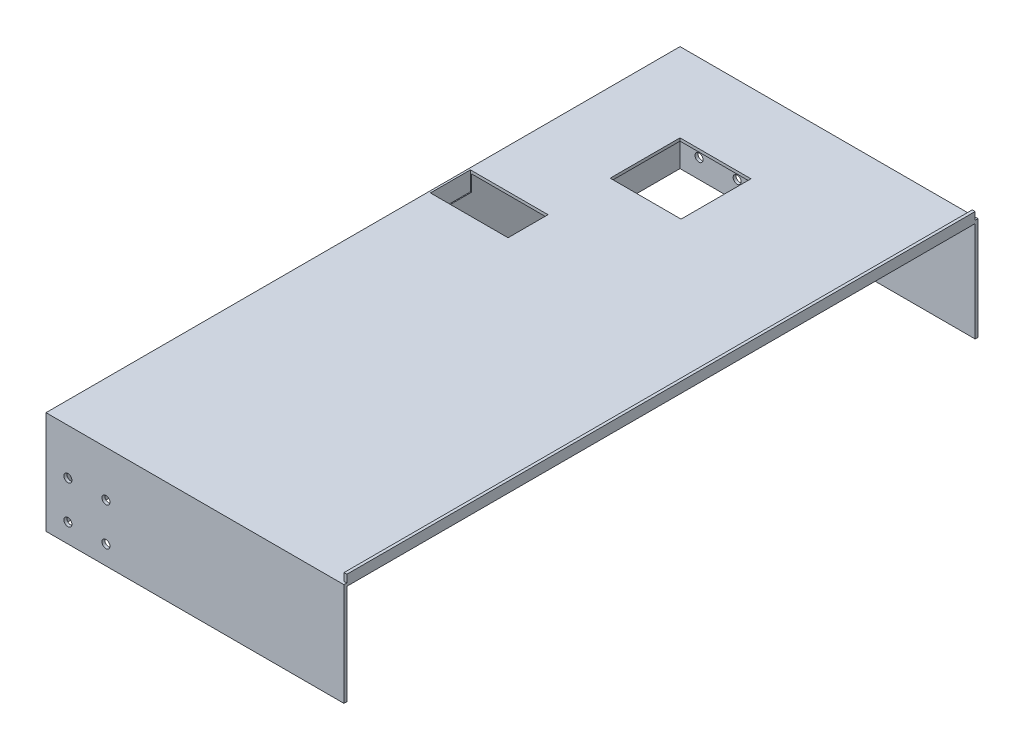
ISO-10303-21;
HEADER;
FILE_DESCRIPTION(('STEP AP214'),'2;1');
FILE_NAME('part.step','',(''),(''),'','','');
FILE_SCHEMA(('AUTOMOTIVE_DESIGN { 1 0 10303 214 1 1 1 1 }'));
ENDSEC;
DATA;
#1=APPLICATION_CONTEXT('core data for automotive mechanical design processes');
#2=APPLICATION_PROTOCOL_DEFINITION('international standard','automotive_design',2000,#1);
#3=PRODUCT_CONTEXT('',#1,'mechanical');
#4=PRODUCT('Part','Part','',(#3));
#5=PRODUCT_RELATED_PRODUCT_CATEGORY('part','',(#4));
#6=PRODUCT_DEFINITION_FORMATION('','',#4);
#7=PRODUCT_DEFINITION_CONTEXT('part definition',#1,'design');
#8=PRODUCT_DEFINITION('design','',#6,#7);
#9=PRODUCT_DEFINITION_SHAPE('','',#8);
#10=(LENGTH_UNIT() NAMED_UNIT(*) SI_UNIT(.MILLI.,.METRE.));
#11=(NAMED_UNIT(*) PLANE_ANGLE_UNIT() SI_UNIT($,.RADIAN.));
#12=(NAMED_UNIT(*) SI_UNIT($,.STERADIAN.) SOLID_ANGLE_UNIT());
#13=UNCERTAINTY_MEASURE_WITH_UNIT(LENGTH_MEASURE(1.E-05),#10,'distance_accuracy_value','');
#14=(GEOMETRIC_REPRESENTATION_CONTEXT(3) GLOBAL_UNCERTAINTY_ASSIGNED_CONTEXT((#13)) GLOBAL_UNIT_ASSIGNED_CONTEXT((#10,
#11,#12)) REPRESENTATION_CONTEXT('',''));
#15=CARTESIAN_POINT('',(0.,0.,0.));
#16=DIRECTION('',(0.,0.,1.));
#17=DIRECTION('',(1.,0.,0.));
#18=AXIS2_PLACEMENT_3D('',#15,#16,#17);
#19=CARTESIAN_POINT('',(179.478375919899,1.5,-330.));
#20=DIRECTION('',(0.,0.,1.));
#21=DIRECTION('',(1.,0.,0.));
#22=AXIS2_PLACEMENT_3D('',#19,#20,#21);
#23=PLANE('',#22);
#24=DIRECTION('',(1.,0.,0.));
#25=VECTOR('',#24,1.);
#26=CARTESIAN_POINT('',(179.478375919899,1.5,-330.));
#27=LINE('',#26,#25);
#28=CARTESIAN_POINT('',(332.978375919899,1.5,-330.));
#29=VERTEX_POINT('',#28);
#30=CARTESIAN_POINT('',(334.478375919899,1.49999999999998,-330.));
#31=VERTEX_POINT('',#30);
#32=EDGE_CURVE('E307',#29,#31,#27,.T.);
#33=ORIENTED_EDGE('',*,*,#32,.F.);
#34=DIRECTION('',(0.,-1.,0.));
#35=VECTOR('',#34,1.);
#36=CARTESIAN_POINT('',(332.978375919899,5.5,-330.));
#37=LINE('',#36,#35);
#38=CARTESIAN_POINT('',(332.978375919899,5.5,-330.));
#39=VERTEX_POINT('',#38);
#40=EDGE_CURVE('E340',#39,#29,#37,.T.);
#41=ORIENTED_EDGE('',*,*,#40,.F.);
#42=DIRECTION('',(-1.,0.,0.));
#43=VECTOR('',#42,1.);
#44=CARTESIAN_POINT('',(334.478375919899,5.5,-330.));
#45=LINE('',#44,#43);
#46=CARTESIAN_POINT('',(334.478375919899,5.5,-330.));
#47=VERTEX_POINT('',#46);
#48=EDGE_CURVE('E323',#47,#39,#45,.T.);
#49=ORIENTED_EDGE('',*,*,#48,.F.);
#50=DIRECTION('',(0.,-1.,0.));
#51=VECTOR('',#50,1.);
#52=CARTESIAN_POINT('',(334.478375919899,1.5,-330.));
#53=LINE('',#52,#51);
#54=EDGE_CURVE('E311',#47,#31,#53,.T.);
#55=ORIENTED_EDGE('',*,*,#54,.T.);
#56=EDGE_LOOP('',(#33,#41,#49,#55));
#57=FACE_BOUND('',#56,.T.);
#58=ADVANCED_FACE('F33',(#57),#23,.F.);
#59=CARTESIAN_POINT('',(0.,1.5,0.));
#60=DIRECTION('',(0.,-1.,0.));
#61=DIRECTION('',(0.,0.,-1.));
#62=AXIS2_PLACEMENT_3D('',#59,#60,#61);
#63=PLANE('',#62);
#64=DIRECTION('',(1.,0.,0.));
#65=VECTOR('',#64,1.);
#66=CARTESIAN_POINT('',(219.478375919899,1.5,-253.305102612016));
#67=LINE('',#66,#65);
#68=CARTESIAN_POINT('',(219.478375919899,1.5,-253.305102612016));
#69=VERTEX_POINT('',#68);
#70=CARTESIAN_POINT('',(256.725232770007,1.5,-253.305102612016));
#71=VERTEX_POINT('',#70);
#72=EDGE_CURVE('E193',#69,#71,#67,.T.);
#73=ORIENTED_EDGE('',*,*,#72,.F.);
#74=DIRECTION('',(0.,0.,1.));
#75=VECTOR('',#74,1.);
#76=CARTESIAN_POINT('',(219.478375919899,1.5,-289.999999999999));
#77=LINE('',#76,#75);
#78=CARTESIAN_POINT('',(219.478375919899,1.5,-289.999999999999));
#79=VERTEX_POINT('',#78);
#80=EDGE_CURVE('E48',#79,#69,#77,.T.);
#81=ORIENTED_EDGE('',*,*,#80,.F.);
#82=DIRECTION('',(-1.,0.,0.));
#83=VECTOR('',#82,1.);
#84=CARTESIAN_POINT('',(219.478375919899,1.5,-289.999999999999));
#85=LINE('',#84,#83);
#86=CARTESIAN_POINT('',(256.725232770007,1.5,-289.999999999999));
#87=VERTEX_POINT('',#86);
#88=EDGE_CURVE('E200',#87,#79,#85,.T.);
#89=ORIENTED_EDGE('',*,*,#88,.F.);
#90=DIRECTION('',(0.,0.,-1.));
#91=VECTOR('',#90,1.);
#92=CARTESIAN_POINT('',(256.725232770007,1.5,-289.999999999999));
#93=LINE('',#92,#91);
#94=EDGE_CURVE('E184',#71,#87,#93,.T.);
#95=ORIENTED_EDGE('',*,*,#94,.F.);
#96=EDGE_LOOP('',(#73,#81,#89,#95));
#97=FACE_BOUND('',#96,.T.);
#98=DIRECTION('',(1.,0.,0.));
#99=VECTOR('',#98,1.);
#100=CARTESIAN_POINT('',(178.98746502645,1.5,-199.381133371279));
#101=LINE('',#100,#99);
#102=CARTESIAN_POINT('',(178.98746502645,1.5,-199.381133371279));
#103=VERTEX_POINT('',#102);
#104=CARTESIAN_POINT('',(219.764181281087,1.5,-199.381133371279));
#105=VERTEX_POINT('',#104);
#106=EDGE_CURVE('E220',#103,#105,#101,.T.);
#107=ORIENTED_EDGE('',*,*,#106,.F.);
#108=DIRECTION('',(0.,0.,1.));
#109=VECTOR('',#108,1.);
#110=CARTESIAN_POINT('',(178.98746502645,1.5,-220.384779624737));
#111=LINE('',#110,#109);
#112=CARTESIAN_POINT('',(178.98746502645,1.5,-220.384779624737));
#113=VERTEX_POINT('',#112);
#114=EDGE_CURVE('E207',#113,#103,#111,.T.);
#115=ORIENTED_EDGE('',*,*,#114,.F.);
#116=DIRECTION('',(-1.,0.,0.));
#117=VECTOR('',#116,1.);
#118=CARTESIAN_POINT('',(178.98746502645,1.5,-220.384779624737));
#119=LINE('',#118,#117);
#120=CARTESIAN_POINT('',(219.764181281087,1.5,-220.384779624737));
#121=VERTEX_POINT('',#120);
#122=EDGE_CURVE('E214',#121,#113,#119,.T.);
#123=ORIENTED_EDGE('',*,*,#122,.F.);
#124=DIRECTION('',(0.,0.,-1.));
#125=VECTOR('',#124,1.);
#126=CARTESIAN_POINT('',(219.764181281087,1.5,-220.384779624737));
#127=LINE('',#126,#125);
#128=EDGE_CURVE('E223',#105,#121,#127,.T.);
#129=ORIENTED_EDGE('',*,*,#128,.F.);
#130=EDGE_LOOP('',(#107,#115,#123,#129));
#131=FACE_BOUND('',#130,.T.);
#132=DIRECTION('',(1.,0.,0.));
#133=VECTOR('',#132,1.);
#134=CARTESIAN_POINT('',(334.478375919899,1.5,0.));
#135=LINE('',#134,#133);
#136=CARTESIAN_POINT('',(332.978375919899,1.5,0.));
#137=VERTEX_POINT('',#136);
#138=CARTESIAN_POINT('',(334.478375919899,1.5,0.));
#139=VERTEX_POINT('',#138);
#140=EDGE_CURVE('E324',#137,#139,#135,.T.);
#141=ORIENTED_EDGE('',*,*,#140,.F.);
#142=DIRECTION('',(0.,0.,1.));
#143=VECTOR('',#142,1.);
#144=CARTESIAN_POINT('',(332.978375919899,1.5,0.));
#145=LINE('',#144,#143);
#146=EDGE_CURVE('E319',#29,#137,#145,.T.);
#147=ORIENTED_EDGE('',*,*,#146,.F.);
#148=ORIENTED_EDGE('',*,*,#32,.T.);
#149=DIRECTION('',(0.,0.,1.));
#150=VECTOR('',#149,1.);
#151=CARTESIAN_POINT('',(334.478375919899,1.49999999999998,-331.5));
#152=LINE('',#151,#150);
#153=CARTESIAN_POINT('',(334.478375919899,1.49999999999998,-331.5));
#154=VERTEX_POINT('',#153);
#155=EDGE_CURVE('E316',#154,#31,#152,.T.);
#156=ORIENTED_EDGE('',*,*,#155,.F.);
#157=DIRECTION('',(1.,0.,0.));
#158=VECTOR('',#157,1.);
#159=CARTESIAN_POINT('',(179.478375919899,1.5,-331.5));
#160=LINE('',#159,#158);
#161=CARTESIAN_POINT('',(177.978375919899,1.5,-331.5));
#162=VERTEX_POINT('',#161);
#163=EDGE_CURVE('E296',#162,#154,#160,.T.);
#164=ORIENTED_EDGE('',*,*,#163,.F.);
#165=DIRECTION('',(0.,0.,-1.));
#166=VECTOR('',#165,1.);
#167=CARTESIAN_POINT('',(177.978375919899,1.5,-331.5));
#168=LINE('',#167,#166);
#169=CARTESIAN_POINT('',(177.978375919899,1.5,1.50000000000005));
#170=VERTEX_POINT('',#169);
#171=EDGE_CURVE('E290',#170,#162,#168,.T.);
#172=ORIENTED_EDGE('',*,*,#171,.F.);
#173=DIRECTION('',(-1.,0.,0.));
#174=VECTOR('',#173,1.);
#175=CARTESIAN_POINT('',(179.478375919899,1.5,1.5));
#176=LINE('',#175,#174);
#177=CARTESIAN_POINT('',(334.478375919899,1.5,1.5));
#178=VERTEX_POINT('',#177);
#179=EDGE_CURVE('E350',#178,#170,#176,.T.);
#180=ORIENTED_EDGE('',*,*,#179,.F.);
#181=DIRECTION('',(0.,0.,-1.));
#182=VECTOR('',#181,1.);
#183=CARTESIAN_POINT('',(334.478375919899,1.5,-330.));
#184=LINE('',#183,#182);
#185=EDGE_CURVE('E362',#178,#139,#184,.T.);
#186=ORIENTED_EDGE('',*,*,#185,.T.);
#187=EDGE_LOOP('',(#141,#147,#148,#156,#164,#172,#180,#186));
#188=FACE_BOUND('',#187,.T.);
#189=ADVANCED_FACE('F197',(#97,#131,#188),#63,.F.);
#190=CARTESIAN_POINT('',(334.478375919899,1.5,-330.));
#191=DIRECTION('',(-1.,0.,0.));
#192=DIRECTION('',(0.,0.,1.));
#193=AXIS2_PLACEMENT_3D('',#190,#191,#192);
#194=PLANE('',#193);
#195=DIRECTION('',(0.,0.,-1.));
#196=VECTOR('',#195,1.);
#197=CARTESIAN_POINT('',(334.478375919899,0.,-330.));
#198=LINE('',#197,#196);
#199=CARTESIAN_POINT('',(334.478375919899,0.,0.));
#200=VERTEX_POINT('',#199);
#201=CARTESIAN_POINT('',(334.478375919899,0.,-330.));
#202=VERTEX_POINT('',#201);
#203=EDGE_CURVE('E371',#200,#202,#198,.T.);
#204=ORIENTED_EDGE('',*,*,#203,.T.);
#205=DIRECTION('',(0.,-1.,0.));
#206=VECTOR('',#205,1.);
#207=CARTESIAN_POINT('',(334.478375919899,1.49999999999998,-330.));
#208=LINE('',#207,#206);
#209=CARTESIAN_POINT('',(334.478375919899,-52.5,-330.));
#210=VERTEX_POINT('',#209);
#211=EDGE_CURVE('E306',#202,#210,#208,.T.);
#212=ORIENTED_EDGE('',*,*,#211,.T.);
#213=DIRECTION('',(0.,0.,1.));
#214=VECTOR('',#213,1.);
#215=CARTESIAN_POINT('',(334.478375919899,-52.5,-331.5));
#216=LINE('',#215,#214);
#217=CARTESIAN_POINT('',(334.478375919899,-52.5,-331.5));
#218=VERTEX_POINT('',#217);
#219=EDGE_CURVE('E303',#218,#210,#216,.T.);
#220=ORIENTED_EDGE('',*,*,#219,.F.);
#221=DIRECTION('',(0.,-1.,0.));
#222=VECTOR('',#221,1.);
#223=CARTESIAN_POINT('',(334.478375919899,1.49999999999998,-331.5));
#224=LINE('',#223,#222);
#225=EDGE_CURVE('E298',#154,#218,#224,.T.);
#226=ORIENTED_EDGE('',*,*,#225,.F.);
#227=ORIENTED_EDGE('',*,*,#155,.T.);
#228=ORIENTED_EDGE('',*,*,#54,.F.);
#229=DIRECTION('',(0.,0.,-1.));
#230=VECTOR('',#229,1.);
#231=CARTESIAN_POINT('',(334.478375919899,5.5,0.));
#232=LINE('',#231,#230);
#233=CARTESIAN_POINT('',(334.478375919899,5.5,0.));
#234=VERTEX_POINT('',#233);
#235=EDGE_CURVE('E320',#234,#47,#232,.T.);
#236=ORIENTED_EDGE('',*,*,#235,.F.);
#237=DIRECTION('',(0.,-1.,0.));
#238=VECTOR('',#237,1.);
#239=CARTESIAN_POINT('',(334.478375919899,5.5,0.));
#240=LINE('',#239,#238);
#241=EDGE_CURVE('E330',#234,#139,#240,.T.);
#242=ORIENTED_EDGE('',*,*,#241,.T.);
#243=ORIENTED_EDGE('',*,*,#185,.F.);
#244=DIRECTION('',(0.,1.,0.));
#245=VECTOR('',#244,1.);
#246=CARTESIAN_POINT('',(334.478375919899,1.5,1.5));
#247=LINE('',#246,#245);
#248=CARTESIAN_POINT('',(334.478375919899,-52.5,1.5));
#249=VERTEX_POINT('',#248);
#250=EDGE_CURVE('E346',#249,#178,#247,.T.);
#251=ORIENTED_EDGE('',*,*,#250,.F.);
#252=DIRECTION('',(0.,0.,-1.));
#253=VECTOR('',#252,1.);
#254=CARTESIAN_POINT('',(334.478375919899,-52.5,1.5));
#255=LINE('',#254,#253);
#256=CARTESIAN_POINT('',(334.478375919899,-52.5,0.));
#257=VERTEX_POINT('',#256);
#258=EDGE_CURVE('E352',#249,#257,#255,.T.);
#259=ORIENTED_EDGE('',*,*,#258,.T.);
#260=DIRECTION('',(0.,1.,0.));
#261=VECTOR('',#260,1.);
#262=CARTESIAN_POINT('',(334.478375919899,1.5,0.));
#263=LINE('',#262,#261);
#264=EDGE_CURVE('E347',#257,#200,#263,.T.);
#265=ORIENTED_EDGE('',*,*,#264,.T.);
#266=EDGE_LOOP('',(#204,#212,#220,#226,#227,#228,#236,#242,#243,#251,#259,#265));
#267=FACE_BOUND('',#266,.T.);
#268=ADVANCED_FACE('F35',(#267),#194,.F.);
#269=CARTESIAN_POINT('',(0.,0.,0.));
#270=DIRECTION('',(0.,-1.,0.));
#271=DIRECTION('',(0.,0.,-1.));
#272=AXIS2_PLACEMENT_3D('',#269,#270,#271);
#273=PLANE('',#272);
#274=DIRECTION('',(0.,0.,-1.));
#275=VECTOR('',#274,1.);
#276=CARTESIAN_POINT('',(219.478375919899,0.,0.));
#277=LINE('',#276,#275);
#278=CARTESIAN_POINT('',(219.478375919899,0.,-253.305102612016));
#279=VERTEX_POINT('',#278);
#280=CARTESIAN_POINT('',(219.478375919899,0.,-289.999999999999));
#281=VERTEX_POINT('',#280);
#282=EDGE_CURVE('E11',#279,#281,#277,.T.);
#283=ORIENTED_EDGE('',*,*,#282,.F.);
#284=DIRECTION('',(-1.,0.,0.));
#285=VECTOR('',#284,1.);
#286=CARTESIAN_POINT('',(0.,0.,-253.305102612016));
#287=LINE('',#286,#285);
#288=CARTESIAN_POINT('',(256.725232770007,0.,-253.305102612016));
#289=VERTEX_POINT('',#288);
#290=EDGE_CURVE('E392',#289,#279,#287,.T.);
#291=ORIENTED_EDGE('',*,*,#290,.F.);
#292=DIRECTION('',(0.,0.,1.));
#293=VECTOR('',#292,1.);
#294=CARTESIAN_POINT('',(256.725232770007,0.,0.));
#295=LINE('',#294,#293);
#296=CARTESIAN_POINT('',(256.725232770007,0.,-289.999999999999));
#297=VERTEX_POINT('',#296);
#298=EDGE_CURVE('E187',#297,#289,#295,.T.);
#299=ORIENTED_EDGE('',*,*,#298,.F.);
#300=DIRECTION('',(1.,0.,0.));
#301=VECTOR('',#300,1.);
#302=CARTESIAN_POINT('',(0.,0.,-289.999999999999));
#303=LINE('',#302,#301);
#304=EDGE_CURVE('E41',#281,#297,#303,.T.);
#305=ORIENTED_EDGE('',*,*,#304,.F.);
#306=EDGE_LOOP('',(#283,#291,#299,#305));
#307=FACE_BOUND('',#306,.T.);
#308=DIRECTION('',(1.,0.,0.));
#309=VECTOR('',#308,1.);
#310=CARTESIAN_POINT('',(0.,0.,-220.384779624737));
#311=LINE('',#310,#309);
#312=CARTESIAN_POINT('',(179.478375919899,0.,-220.384779624737));
#313=VERTEX_POINT('',#312);
#314=CARTESIAN_POINT('',(219.764181281087,0.,-220.384779624737));
#315=VERTEX_POINT('',#314);
#316=EDGE_CURVE('E238',#313,#315,#311,.T.);
#317=ORIENTED_EDGE('',*,*,#316,.F.);
#318=DIRECTION('',(0.,0.,1.));
#319=VECTOR('',#318,1.);
#320=CARTESIAN_POINT('',(179.478375919899,0.,0.));
#321=LINE('',#320,#319);
#322=CARTESIAN_POINT('',(179.478375919899,0.,-330.));
#323=VERTEX_POINT('',#322);
#324=EDGE_CURVE('E365',#323,#313,#321,.T.);
#325=ORIENTED_EDGE('',*,*,#324,.F.);
#326=DIRECTION('',(-1.,0.,0.));
#327=VECTOR('',#326,1.);
#328=CARTESIAN_POINT('',(179.478375919899,0.,-330.));
#329=LINE('',#328,#327);
#330=EDGE_CURVE('E364',#202,#323,#329,.T.);
#331=ORIENTED_EDGE('',*,*,#330,.F.);
#332=ORIENTED_EDGE('',*,*,#203,.F.);
#333=DIRECTION('',(1.,0.,0.));
#334=VECTOR('',#333,1.);
#335=CARTESIAN_POINT('',(334.478375919899,0.,0.));
#336=LINE('',#335,#334);
#337=CARTESIAN_POINT('',(179.478375919899,0.,0.));
#338=VERTEX_POINT('',#337);
#339=EDGE_CURVE('E368',#338,#200,#336,.T.);
#340=ORIENTED_EDGE('',*,*,#339,.F.);
#341=CARTESIAN_POINT('',(179.478375919899,0.,-199.381133371279));
#342=VERTEX_POINT('',#341);
#343=EDGE_CURVE('E361',#342,#338,#321,.T.);
#344=ORIENTED_EDGE('',*,*,#343,.F.);
#345=DIRECTION('',(-1.,0.,0.));
#346=VECTOR('',#345,1.);
#347=CARTESIAN_POINT('',(0.,0.,-199.381133371279));
#348=LINE('',#347,#346);
#349=CARTESIAN_POINT('',(219.764181281087,0.,-199.381133371279));
#350=VERTEX_POINT('',#349);
#351=EDGE_CURVE('E230',#350,#342,#348,.T.);
#352=ORIENTED_EDGE('',*,*,#351,.F.);
#353=DIRECTION('',(0.,0.,1.));
#354=VECTOR('',#353,1.);
#355=CARTESIAN_POINT('',(219.764181281087,0.,0.));
#356=LINE('',#355,#354);
#357=EDGE_CURVE('E390',#315,#350,#356,.T.);
#358=ORIENTED_EDGE('',*,*,#357,.F.);
#359=EDGE_LOOP('',(#317,#325,#331,#332,#340,#344,#352,#358));
#360=FACE_BOUND('',#359,.T.);
#361=ADVANCED_FACE('F400',(#307,#360),#273,.T.);
#362=CARTESIAN_POINT('',(0.,0.,0.));
#363=DIRECTION('',(0.,0.,1.));
#364=DIRECTION('',(1.,0.,0.));
#365=AXIS2_PLACEMENT_3D('',#362,#363,#364);
#366=PLANE('',#365);
#367=CARTESIAN_POINT('',(209.478375919899,-22.5,0.));
#368=DIRECTION('',(0.,0.,1.));
#369=DIRECTION('',(1.,0.,0.));
#370=AXIS2_PLACEMENT_3D('',#367,#368,#369);
#371=CIRCLE('',#370,2.09999999999999);
#372=CARTESIAN_POINT('',(211.578375919899,-22.5,0.));
#373=VERTEX_POINT('',#372);
#374=EDGE_CURVE('E243',#373,#373,#371,.T.);
#375=ORIENTED_EDGE('',*,*,#374,.T.);
#376=EDGE_LOOP('',(#375));
#377=FACE_BOUND('',#376,.T.);
#378=CARTESIAN_POINT('',(189.478375919899,-22.5,0.));
#379=DIRECTION('',(0.,0.,1.));
#380=DIRECTION('',(1.,0.,0.));
#381=AXIS2_PLACEMENT_3D('',#378,#379,#380);
#382=CIRCLE('',#381,2.09999999999999);
#383=CARTESIAN_POINT('',(191.578375919899,-22.5,0.));
#384=VERTEX_POINT('',#383);
#385=EDGE_CURVE('E249',#384,#384,#382,.T.);
#386=ORIENTED_EDGE('',*,*,#385,.T.);
#387=EDGE_LOOP('',(#386));
#388=FACE_BOUND('',#387,.T.);
#389=CARTESIAN_POINT('',(189.478375919899,-42.5,0.));
#390=DIRECTION('',(0.,0.,1.));
#391=DIRECTION('',(1.,0.,0.));
#392=AXIS2_PLACEMENT_3D('',#389,#390,#391);
#393=CIRCLE('',#392,2.09999999999999);
#394=CARTESIAN_POINT('',(191.578375919899,-42.5,0.));
#395=VERTEX_POINT('',#394);
#396=EDGE_CURVE('E267',#395,#395,#393,.T.);
#397=ORIENTED_EDGE('',*,*,#396,.T.);
#398=EDGE_LOOP('',(#397));
#399=FACE_BOUND('',#398,.T.);
#400=CARTESIAN_POINT('',(209.478375919899,-42.5,0.));
#401=DIRECTION('',(0.,0.,1.));
#402=DIRECTION('',(1.,0.,0.));
#403=AXIS2_PLACEMENT_3D('',#400,#401,#402);
#404=CIRCLE('',#403,2.09999999999999);
#405=CARTESIAN_POINT('',(211.578375919899,-42.5,0.));
#406=VERTEX_POINT('',#405);
#407=EDGE_CURVE('E273',#406,#406,#404,.T.);
#408=ORIENTED_EDGE('',*,*,#407,.T.);
#409=EDGE_LOOP('',(#408));
#410=FACE_BOUND('',#409,.T.);
#411=DIRECTION('',(0.,-1.,0.));
#412=VECTOR('',#411,1.);
#413=CARTESIAN_POINT('',(179.478375919899,1.5,0.));
#414=LINE('',#413,#412);
#415=CARTESIAN_POINT('',(179.478375919899,-52.5,0.));
#416=VERTEX_POINT('',#415);
#417=EDGE_CURVE('E343',#338,#416,#414,.T.);
#418=ORIENTED_EDGE('',*,*,#417,.F.);
#419=ORIENTED_EDGE('',*,*,#339,.T.);
#420=ORIENTED_EDGE('',*,*,#264,.F.);
#421=DIRECTION('',(1.,0.,0.));
#422=VECTOR('',#421,1.);
#423=CARTESIAN_POINT('',(179.478375919899,-52.5,0.));
#424=LINE('',#423,#422);
#425=EDGE_CURVE('E355',#416,#257,#424,.T.);
#426=ORIENTED_EDGE('',*,*,#425,.F.);
#427=EDGE_LOOP('',(#418,#419,#420,#426));
#428=FACE_BOUND('',#427,.T.);
#429=ADVANCED_FACE('F425',(#377,#388,#399,#410,#428),#366,.F.);
#430=CARTESIAN_POINT('',(179.478375919899,-52.5,1.5));
#431=DIRECTION('',(0.,1.,0.));
#432=DIRECTION('',(0.,0.,1.));
#433=AXIS2_PLACEMENT_3D('',#430,#431,#432);
#434=PLANE('',#433);
#435=ORIENTED_EDGE('',*,*,#425,.T.);
#436=ORIENTED_EDGE('',*,*,#258,.F.);
#437=DIRECTION('',(1.,0.,0.));
#438=VECTOR('',#437,1.);
#439=CARTESIAN_POINT('',(179.478375919899,-52.5,1.5));
#440=LINE('',#439,#438);
#441=CARTESIAN_POINT('',(177.978375919899,-52.5,1.50000000000005));
#442=VERTEX_POINT('',#441);
#443=EDGE_CURVE('E344',#442,#249,#440,.T.);
#444=ORIENTED_EDGE('',*,*,#443,.F.);
#445=DIRECTION('',(0.,0.,1.));
#446=VECTOR('',#445,1.);
#447=CARTESIAN_POINT('',(177.978375919899,-52.5,-331.5));
#448=LINE('',#447,#446);
#449=CARTESIAN_POINT('',(177.978375919899,-52.5,-331.5));
#450=VERTEX_POINT('',#449);
#451=EDGE_CURVE('E283',#450,#442,#448,.T.);
#452=ORIENTED_EDGE('',*,*,#451,.F.);
#453=DIRECTION('',(-1.,0.,0.));
#454=VECTOR('',#453,1.);
#455=CARTESIAN_POINT('',(179.478375919899,-52.5,-331.5));
#456=LINE('',#455,#454);
#457=EDGE_CURVE('E301',#218,#450,#456,.T.);
#458=ORIENTED_EDGE('',*,*,#457,.F.);
#459=ORIENTED_EDGE('',*,*,#219,.T.);
#460=DIRECTION('',(-1.,0.,0.));
#461=VECTOR('',#460,1.);
#462=CARTESIAN_POINT('',(179.478375919899,-52.5,-330.));
#463=LINE('',#462,#461);
#464=CARTESIAN_POINT('',(179.478375919899,-52.5,-330.));
#465=VERTEX_POINT('',#464);
#466=EDGE_CURVE('E299',#210,#465,#463,.T.);
#467=ORIENTED_EDGE('',*,*,#466,.T.);
#468=DIRECTION('',(0.,0.,1.));
#469=VECTOR('',#468,1.);
#470=CARTESIAN_POINT('',(179.478375919899,-52.5,-331.5));
#471=LINE('',#470,#469);
#472=EDGE_CURVE('E284',#465,#416,#471,.T.);
#473=ORIENTED_EDGE('',*,*,#472,.T.);
#474=EDGE_LOOP('',(#435,#436,#444,#452,#458,#459,#467,#473));
#475=FACE_BOUND('',#474,.T.);
#476=ADVANCED_FACE('F427',(#475),#434,.F.);
#477=CARTESIAN_POINT('',(0.,0.,1.5));
#478=DIRECTION('',(0.,0.,1.));
#479=DIRECTION('',(1.,0.,0.));
#480=AXIS2_PLACEMENT_3D('',#477,#478,#479);
#481=PLANE('',#480);
#482=CARTESIAN_POINT('',(209.478375919899,-22.5,1.5));
#483=DIRECTION('',(0.,0.,1.));
#484=DIRECTION('',(1.,0.,0.));
#485=AXIS2_PLACEMENT_3D('',#482,#483,#484);
#486=CIRCLE('',#485,2.09999999999999);
#487=CARTESIAN_POINT('',(211.578375919899,-22.5,1.5));
#488=VERTEX_POINT('',#487);
#489=EDGE_CURVE('E240',#488,#488,#486,.T.);
#490=ORIENTED_EDGE('',*,*,#489,.F.);
#491=EDGE_LOOP('',(#490));
#492=FACE_BOUND('',#491,.T.);
#493=CARTESIAN_POINT('',(189.478375919899,-22.5,1.5));
#494=DIRECTION('',(0.,0.,1.));
#495=DIRECTION('',(1.,0.,0.));
#496=AXIS2_PLACEMENT_3D('',#493,#494,#495);
#497=CIRCLE('',#496,2.09999999999999);
#498=CARTESIAN_POINT('',(191.578375919899,-22.5,1.5));
#499=VERTEX_POINT('',#498);
#500=EDGE_CURVE('E246',#499,#499,#497,.T.);
#501=ORIENTED_EDGE('',*,*,#500,.F.);
#502=EDGE_LOOP('',(#501));
#503=FACE_BOUND('',#502,.T.);
#504=CARTESIAN_POINT('',(189.478375919899,-42.5,1.5));
#505=DIRECTION('',(0.,0.,1.));
#506=DIRECTION('',(1.,0.,0.));
#507=AXIS2_PLACEMENT_3D('',#504,#505,#506);
#508=CIRCLE('',#507,2.09999999999999);
#509=CARTESIAN_POINT('',(191.578375919899,-42.5,1.5));
#510=VERTEX_POINT('',#509);
#511=EDGE_CURVE('E264',#510,#510,#508,.T.);
#512=ORIENTED_EDGE('',*,*,#511,.F.);
#513=EDGE_LOOP('',(#512));
#514=FACE_BOUND('',#513,.T.);
#515=CARTESIAN_POINT('',(209.478375919899,-42.5,1.5));
#516=DIRECTION('',(0.,0.,1.));
#517=DIRECTION('',(1.,0.,0.));
#518=AXIS2_PLACEMENT_3D('',#515,#516,#517);
#519=CIRCLE('',#518,2.09999999999999);
#520=CARTESIAN_POINT('',(211.578375919899,-42.5,1.5));
#521=VERTEX_POINT('',#520);
#522=EDGE_CURVE('E270',#521,#521,#519,.T.);
#523=ORIENTED_EDGE('',*,*,#522,.F.);
#524=EDGE_LOOP('',(#523));
#525=FACE_BOUND('',#524,.T.);
#526=ORIENTED_EDGE('',*,*,#179,.T.);
#527=DIRECTION('',(0.,1.,0.));
#528=VECTOR('',#527,1.);
#529=CARTESIAN_POINT('',(177.978375919899,1.5,1.50000000000005));
#530=LINE('',#529,#528);
#531=EDGE_CURVE('E287',#442,#170,#530,.T.);
#532=ORIENTED_EDGE('',*,*,#531,.F.);
#533=ORIENTED_EDGE('',*,*,#443,.T.);
#534=ORIENTED_EDGE('',*,*,#250,.T.);
#535=EDGE_LOOP('',(#526,#532,#533,#534));
#536=FACE_BOUND('',#535,.T.);
#537=ADVANCED_FACE('F430',(#492,#503,#514,#525,#536),#481,.T.);
#538=CARTESIAN_POINT('',(332.978375919899,5.5,0.));
#539=DIRECTION('',(1.,0.,0.));
#540=DIRECTION('',(0.,0.,-1.));
#541=AXIS2_PLACEMENT_3D('',#538,#539,#540);
#542=PLANE('',#541);
#543=ORIENTED_EDGE('',*,*,#146,.T.);
#544=DIRECTION('',(0.,-1.,0.));
#545=VECTOR('',#544,1.);
#546=CARTESIAN_POINT('',(332.978375919899,5.5,0.));
#547=LINE('',#546,#545);
#548=CARTESIAN_POINT('',(332.978375919899,5.5,0.));
#549=VERTEX_POINT('',#548);
#550=EDGE_CURVE('E337',#549,#137,#547,.T.);
#551=ORIENTED_EDGE('',*,*,#550,.F.);
#552=DIRECTION('',(0.,0.,1.));
#553=VECTOR('',#552,1.);
#554=CARTESIAN_POINT('',(332.978375919899,5.5,0.));
#555=LINE('',#554,#553);
#556=EDGE_CURVE('E326',#39,#549,#555,.T.);
#557=ORIENTED_EDGE('',*,*,#556,.F.);
#558=ORIENTED_EDGE('',*,*,#40,.T.);
#559=EDGE_LOOP('',(#543,#551,#557,#558));
#560=FACE_BOUND('',#559,.T.);
#561=ADVANCED_FACE('F437',(#560),#542,.F.);
#562=CARTESIAN_POINT('',(334.478375919899,5.5,0.));
#563=DIRECTION('',(0.,0.,-1.));
#564=DIRECTION('',(-1.,0.,0.));
#565=AXIS2_PLACEMENT_3D('',#562,#563,#564);
#566=PLANE('',#565);
#567=ORIENTED_EDGE('',*,*,#140,.T.);
#568=ORIENTED_EDGE('',*,*,#241,.F.);
#569=DIRECTION('',(1.,0.,0.));
#570=VECTOR('',#569,1.);
#571=CARTESIAN_POINT('',(334.478375919899,5.5,0.));
#572=LINE('',#571,#570);
#573=EDGE_CURVE('E328',#549,#234,#572,.T.);
#574=ORIENTED_EDGE('',*,*,#573,.F.);
#575=ORIENTED_EDGE('',*,*,#550,.T.);
#576=EDGE_LOOP('',(#567,#568,#574,#575));
#577=FACE_BOUND('',#576,.T.);
#578=ADVANCED_FACE('F441',(#577),#566,.F.);
#579=CARTESIAN_POINT('',(0.,5.5,0.));
#580=DIRECTION('',(0.,1.,0.));
#581=DIRECTION('',(0.,0.,1.));
#582=AXIS2_PLACEMENT_3D('',#579,#580,#581);
#583=PLANE('',#582);
#584=ORIENTED_EDGE('',*,*,#235,.T.);
#585=ORIENTED_EDGE('',*,*,#48,.T.);
#586=ORIENTED_EDGE('',*,*,#556,.T.);
#587=ORIENTED_EDGE('',*,*,#573,.T.);
#588=EDGE_LOOP('',(#584,#585,#586,#587));
#589=FACE_BOUND('',#588,.T.);
#590=ADVANCED_FACE('F445',(#589),#583,.T.);
#591=CARTESIAN_POINT('',(0.,0.,-331.5));
#592=DIRECTION('',(0.,0.,1.));
#593=DIRECTION('',(1.,0.,0.));
#594=AXIS2_PLACEMENT_3D('',#591,#592,#593);
#595=PLANE('',#594);
#596=CARTESIAN_POINT('',(209.478375919899,-22.5,-331.5));
#597=DIRECTION('',(0.,0.,-1.));
#598=DIRECTION('',(-1.,0.,0.));
#599=AXIS2_PLACEMENT_3D('',#596,#597,#598);
#600=CIRCLE('',#599,2.09999999999999);
#601=CARTESIAN_POINT('',(207.378375919899,-22.5,-331.5));
#602=VERTEX_POINT('',#601);
#603=EDGE_CURVE('E252',#602,#602,#600,.T.);
#604=ORIENTED_EDGE('',*,*,#603,.F.);
#605=EDGE_LOOP('',(#604));
#606=FACE_BOUND('',#605,.T.);
#607=CARTESIAN_POINT('',(189.478375919899,-22.5,-331.5));
#608=DIRECTION('',(0.,0.,-1.));
#609=DIRECTION('',(-1.,0.,0.));
#610=AXIS2_PLACEMENT_3D('',#607,#608,#609);
#611=CIRCLE('',#610,2.09999999999999);
#612=CARTESIAN_POINT('',(187.378375919899,-22.5,-331.5));
#613=VERTEX_POINT('',#612);
#614=EDGE_CURVE('E256',#613,#613,#611,.T.);
#615=ORIENTED_EDGE('',*,*,#614,.F.);
#616=EDGE_LOOP('',(#615));
#617=FACE_BOUND('',#616,.T.);
#618=CARTESIAN_POINT('',(189.478375919899,-42.5,-331.5));
#619=DIRECTION('',(0.,0.,-1.));
#620=DIRECTION('',(-1.,0.,0.));
#621=AXIS2_PLACEMENT_3D('',#618,#619,#620);
#622=CIRCLE('',#621,2.09999999999999);
#623=CARTESIAN_POINT('',(187.378375919899,-42.5,-331.5));
#624=VERTEX_POINT('',#623);
#625=EDGE_CURVE('E260',#624,#624,#622,.T.);
#626=ORIENTED_EDGE('',*,*,#625,.F.);
#627=EDGE_LOOP('',(#626));
#628=FACE_BOUND('',#627,.T.);
#629=CARTESIAN_POINT('',(209.478375919899,-42.5,-331.5));
#630=DIRECTION('',(0.,0.,-1.));
#631=DIRECTION('',(-1.,0.,0.));
#632=AXIS2_PLACEMENT_3D('',#629,#630,#631);
#633=CIRCLE('',#632,2.09999999999999);
#634=CARTESIAN_POINT('',(207.378375919899,-42.5,-331.5));
#635=VERTEX_POINT('',#634);
#636=EDGE_CURVE('E276',#635,#635,#633,.T.);
#637=ORIENTED_EDGE('',*,*,#636,.F.);
#638=EDGE_LOOP('',(#637));
#639=FACE_BOUND('',#638,.T.);
#640=ORIENTED_EDGE('',*,*,#457,.T.);
#641=DIRECTION('',(0.,-1.,0.));
#642=VECTOR('',#641,1.);
#643=CARTESIAN_POINT('',(177.978375919899,1.5,-331.5));
#644=LINE('',#643,#642);
#645=EDGE_CURVE('E280',#162,#450,#644,.T.);
#646=ORIENTED_EDGE('',*,*,#645,.F.);
#647=ORIENTED_EDGE('',*,*,#163,.T.);
#648=ORIENTED_EDGE('',*,*,#225,.T.);
#649=EDGE_LOOP('',(#640,#646,#647,#648));
#650=FACE_BOUND('',#649,.T.);
#651=ADVANCED_FACE('F449',(#606,#617,#628,#639,#650),#595,.F.);
#652=CARTESIAN_POINT('',(0.,0.,-330.));
#653=DIRECTION('',(0.,0.,1.));
#654=DIRECTION('',(1.,0.,0.));
#655=AXIS2_PLACEMENT_3D('',#652,#653,#654);
#656=PLANE('',#655);
#657=CARTESIAN_POINT('',(209.478375919899,-22.5,-330.));
#658=DIRECTION('',(0.,0.,1.));
#659=DIRECTION('',(1.,0.,0.));
#660=AXIS2_PLACEMENT_3D('',#657,#658,#659);
#661=CIRCLE('',#660,2.09999999999999);
#662=CARTESIAN_POINT('',(211.578375919899,-22.5,-330.));
#663=VERTEX_POINT('',#662);
#664=EDGE_CURVE('E255',#663,#663,#661,.T.);
#665=ORIENTED_EDGE('',*,*,#664,.F.);
#666=EDGE_LOOP('',(#665));
#667=FACE_BOUND('',#666,.T.);
#668=CARTESIAN_POINT('',(189.478375919899,-22.5,-330.));
#669=DIRECTION('',(0.,0.,1.));
#670=DIRECTION('',(1.,0.,0.));
#671=AXIS2_PLACEMENT_3D('',#668,#669,#670);
#672=CIRCLE('',#671,2.09999999999999);
#673=CARTESIAN_POINT('',(191.578375919899,-22.5,-330.));
#674=VERTEX_POINT('',#673);
#675=EDGE_CURVE('E259',#674,#674,#672,.T.);
#676=ORIENTED_EDGE('',*,*,#675,.F.);
#677=EDGE_LOOP('',(#676));
#678=FACE_BOUND('',#677,.T.);
#679=CARTESIAN_POINT('',(189.478375919899,-42.5,-330.));
#680=DIRECTION('',(0.,0.,1.));
#681=DIRECTION('',(1.,0.,0.));
#682=AXIS2_PLACEMENT_3D('',#679,#680,#681);
#683=CIRCLE('',#682,2.09999999999999);
#684=CARTESIAN_POINT('',(191.578375919899,-42.5,-330.));
#685=VERTEX_POINT('',#684);
#686=EDGE_CURVE('E263',#685,#685,#683,.T.);
#687=ORIENTED_EDGE('',*,*,#686,.F.);
#688=EDGE_LOOP('',(#687));
#689=FACE_BOUND('',#688,.T.);
#690=CARTESIAN_POINT('',(209.478375919899,-42.5,-330.));
#691=DIRECTION('',(0.,0.,1.));
#692=DIRECTION('',(1.,0.,0.));
#693=AXIS2_PLACEMENT_3D('',#690,#691,#692);
#694=CIRCLE('',#693,2.09999999999999);
#695=CARTESIAN_POINT('',(211.578375919899,-42.5,-330.));
#696=VERTEX_POINT('',#695);
#697=EDGE_CURVE('E279',#696,#696,#694,.T.);
#698=ORIENTED_EDGE('',*,*,#697,.F.);
#699=EDGE_LOOP('',(#698));
#700=FACE_BOUND('',#699,.T.);
#701=ORIENTED_EDGE('',*,*,#211,.F.);
#702=ORIENTED_EDGE('',*,*,#330,.T.);
#703=DIRECTION('',(0.,1.,0.));
#704=VECTOR('',#703,1.);
#705=CARTESIAN_POINT('',(179.478375919899,1.5,-330.));
#706=LINE('',#705,#704);
#707=EDGE_CURVE('E293',#465,#323,#706,.T.);
#708=ORIENTED_EDGE('',*,*,#707,.F.);
#709=ORIENTED_EDGE('',*,*,#466,.F.);
#710=EDGE_LOOP('',(#701,#702,#708,#709));
#711=FACE_BOUND('',#710,.T.);
#712=ADVANCED_FACE('F451',(#667,#678,#689,#700,#711),#656,.T.);
#713=CARTESIAN_POINT('',(179.478375919899,0.,0.));
#714=DIRECTION('',(-1.,0.,0.));
#715=DIRECTION('',(0.,0.,1.));
#716=AXIS2_PLACEMENT_3D('',#713,#714,#715);
#717=PLANE('',#716);
#718=ORIENTED_EDGE('',*,*,#324,.T.);
#719=DIRECTION('',(0.,-1.,0.));
#720=VECTOR('',#719,1.);
#721=CARTESIAN_POINT('',(179.478375919899,0.,-220.384779624737));
#722=LINE('',#721,#720);
#723=CARTESIAN_POINT('',(179.478375919899,-8.5,-220.384779624737));
#724=VERTEX_POINT('',#723);
#725=EDGE_CURVE('E387',#313,#724,#722,.T.);
#726=ORIENTED_EDGE('',*,*,#725,.T.);
#727=DIRECTION('',(0.,0.,-1.));
#728=VECTOR('',#727,1.);
#729=CARTESIAN_POINT('',(179.478375919899,-8.5,0.));
#730=LINE('',#729,#728);
#731=CARTESIAN_POINT('',(179.478375919899,-8.5,-199.381133371279));
#732=VERTEX_POINT('',#731);
#733=EDGE_CURVE('E310',#732,#724,#730,.T.);
#734=ORIENTED_EDGE('',*,*,#733,.F.);
#735=DIRECTION('',(0.,1.,0.));
#736=VECTOR('',#735,1.);
#737=CARTESIAN_POINT('',(179.478375919899,0.,-199.381133371279));
#738=LINE('',#737,#736);
#739=EDGE_CURVE('E384',#732,#342,#738,.T.);
#740=ORIENTED_EDGE('',*,*,#739,.T.);
#741=ORIENTED_EDGE('',*,*,#343,.T.);
#742=ORIENTED_EDGE('',*,*,#417,.T.);
#743=ORIENTED_EDGE('',*,*,#472,.F.);
#744=ORIENTED_EDGE('',*,*,#707,.T.);
#745=EDGE_LOOP('',(#718,#726,#734,#740,#741,#742,#743,#744));
#746=FACE_BOUND('',#745,.T.);
#747=ADVANCED_FACE('F454',(#746),#717,.F.);
#748=CARTESIAN_POINT('',(177.978375919899,0.,0.));
#749=DIRECTION('',(-1.,0.,0.));
#750=DIRECTION('',(0.,0.,1.));
#751=AXIS2_PLACEMENT_3D('',#748,#749,#750);
#752=PLANE('',#751);
#753=ORIENTED_EDGE('',*,*,#645,.T.);
#754=ORIENTED_EDGE('',*,*,#451,.T.);
#755=ORIENTED_EDGE('',*,*,#531,.T.);
#756=ORIENTED_EDGE('',*,*,#171,.T.);
#757=EDGE_LOOP('',(#753,#754,#755,#756));
#758=FACE_BOUND('',#757,.T.);
#759=ADVANCED_FACE('F461',(#758),#752,.T.);
#760=CARTESIAN_POINT('',(209.478375919899,-42.5,-321.5));
#761=DIRECTION('',(0.,0.,-1.));
#762=DIRECTION('',(-1.,0.,0.));
#763=AXIS2_PLACEMENT_3D('',#760,#761,#762);
#764=CYLINDRICAL_SURFACE('',#763,2.09999999999999);
#765=ORIENTED_EDGE('',*,*,#697,.T.);
#766=EDGE_LOOP('',(#765));
#767=FACE_BOUND('',#766,.T.);
#768=ORIENTED_EDGE('',*,*,#636,.T.);
#769=EDGE_LOOP('',(#768));
#770=FACE_BOUND('',#769,.T.);
#771=ADVANCED_FACE('F465',(#767,#770),#764,.F.);
#772=CARTESIAN_POINT('',(209.478375919899,-42.5,-8.5));
#773=DIRECTION('',(0.,0.,1.));
#774=DIRECTION('',(1.,0.,0.));
#775=AXIS2_PLACEMENT_3D('',#772,#773,#774);
#776=CYLINDRICAL_SURFACE('',#775,2.09999999999999);
#777=ORIENTED_EDGE('',*,*,#522,.T.);
#778=EDGE_LOOP('',(#777));
#779=FACE_BOUND('',#778,.T.);
#780=ORIENTED_EDGE('',*,*,#407,.F.);
#781=EDGE_LOOP('',(#780));
#782=FACE_BOUND('',#781,.T.);
#783=ADVANCED_FACE('F469',(#779,#782),#776,.F.);
#784=CARTESIAN_POINT('',(189.478375919899,-42.5,-8.5));
#785=DIRECTION('',(0.,0.,1.));
#786=DIRECTION('',(1.,0.,0.));
#787=AXIS2_PLACEMENT_3D('',#784,#785,#786);
#788=CYLINDRICAL_SURFACE('',#787,2.09999999999999);
#789=ORIENTED_EDGE('',*,*,#511,.T.);
#790=EDGE_LOOP('',(#789));
#791=FACE_BOUND('',#790,.T.);
#792=ORIENTED_EDGE('',*,*,#396,.F.);
#793=EDGE_LOOP('',(#792));
#794=FACE_BOUND('',#793,.T.);
#795=ADVANCED_FACE('F473',(#791,#794),#788,.F.);
#796=CARTESIAN_POINT('',(189.478375919899,-42.5,-321.5));
#797=DIRECTION('',(0.,0.,-1.));
#798=DIRECTION('',(-1.,0.,0.));
#799=AXIS2_PLACEMENT_3D('',#796,#797,#798);
#800=CYLINDRICAL_SURFACE('',#799,2.09999999999999);
#801=ORIENTED_EDGE('',*,*,#686,.T.);
#802=EDGE_LOOP('',(#801));
#803=FACE_BOUND('',#802,.T.);
#804=ORIENTED_EDGE('',*,*,#625,.T.);
#805=EDGE_LOOP('',(#804));
#806=FACE_BOUND('',#805,.T.);
#807=ADVANCED_FACE('F477',(#803,#806),#800,.F.);
#808=CARTESIAN_POINT('',(189.478375919899,-22.5,-321.5));
#809=DIRECTION('',(0.,0.,-1.));
#810=DIRECTION('',(-1.,0.,0.));
#811=AXIS2_PLACEMENT_3D('',#808,#809,#810);
#812=CYLINDRICAL_SURFACE('',#811,2.09999999999999);
#813=ORIENTED_EDGE('',*,*,#675,.T.);
#814=EDGE_LOOP('',(#813));
#815=FACE_BOUND('',#814,.T.);
#816=ORIENTED_EDGE('',*,*,#614,.T.);
#817=EDGE_LOOP('',(#816));
#818=FACE_BOUND('',#817,.T.);
#819=ADVANCED_FACE('F481',(#815,#818),#812,.F.);
#820=CARTESIAN_POINT('',(209.478375919899,-22.5,-321.5));
#821=DIRECTION('',(0.,0.,-1.));
#822=DIRECTION('',(-1.,0.,0.));
#823=AXIS2_PLACEMENT_3D('',#820,#821,#822);
#824=CYLINDRICAL_SURFACE('',#823,2.09999999999999);
#825=ORIENTED_EDGE('',*,*,#664,.T.);
#826=EDGE_LOOP('',(#825));
#827=FACE_BOUND('',#826,.T.);
#828=ORIENTED_EDGE('',*,*,#603,.T.);
#829=EDGE_LOOP('',(#828));
#830=FACE_BOUND('',#829,.T.);
#831=ADVANCED_FACE('F485',(#827,#830),#824,.F.);
#832=CARTESIAN_POINT('',(189.478375919899,-22.5,-8.5));
#833=DIRECTION('',(0.,0.,1.));
#834=DIRECTION('',(1.,0.,0.));
#835=AXIS2_PLACEMENT_3D('',#832,#833,#834);
#836=CYLINDRICAL_SURFACE('',#835,2.09999999999999);
#837=ORIENTED_EDGE('',*,*,#500,.T.);
#838=EDGE_LOOP('',(#837));
#839=FACE_BOUND('',#838,.T.);
#840=ORIENTED_EDGE('',*,*,#385,.F.);
#841=EDGE_LOOP('',(#840));
#842=FACE_BOUND('',#841,.T.);
#843=ADVANCED_FACE('F489',(#839,#842),#836,.F.);
#844=CARTESIAN_POINT('',(209.478375919899,-22.5,-8.5));
#845=DIRECTION('',(0.,0.,1.));
#846=DIRECTION('',(1.,0.,0.));
#847=AXIS2_PLACEMENT_3D('',#844,#845,#846);
#848=CYLINDRICAL_SURFACE('',#847,2.09999999999999);
#849=ORIENTED_EDGE('',*,*,#489,.T.);
#850=EDGE_LOOP('',(#849));
#851=FACE_BOUND('',#850,.T.);
#852=ORIENTED_EDGE('',*,*,#374,.F.);
#853=EDGE_LOOP('',(#852));
#854=FACE_BOUND('',#853,.T.);
#855=ADVANCED_FACE('F493',(#851,#854),#848,.F.);
#856=CARTESIAN_POINT('',(0.,-8.5,0.));
#857=DIRECTION('',(0.,1.,0.));
#858=DIRECTION('',(0.,0.,1.));
#859=AXIS2_PLACEMENT_3D('',#856,#857,#858);
#860=PLANE('',#859);
#861=ORIENTED_EDGE('',*,*,#733,.T.);
#862=DIRECTION('',(-1.,0.,0.));
#863=VECTOR('',#862,1.);
#864=CARTESIAN_POINT('',(178.98746502645,-8.5,-220.384779624737));
#865=LINE('',#864,#863);
#866=CARTESIAN_POINT('',(178.98746502645,-8.5,-220.384779624737));
#867=VERTEX_POINT('',#866);
#868=EDGE_CURVE('E216',#724,#867,#865,.T.);
#869=ORIENTED_EDGE('',*,*,#868,.T.);
#870=DIRECTION('',(0.,0.,1.));
#871=VECTOR('',#870,1.);
#872=CARTESIAN_POINT('',(178.98746502645,-8.5,-220.384779624737));
#873=LINE('',#872,#871);
#874=CARTESIAN_POINT('',(178.98746502645,-8.5,-199.381133371279));
#875=VERTEX_POINT('',#874);
#876=EDGE_CURVE('E210',#867,#875,#873,.T.);
#877=ORIENTED_EDGE('',*,*,#876,.T.);
#878=DIRECTION('',(1.,0.,0.));
#879=VECTOR('',#878,1.);
#880=CARTESIAN_POINT('',(178.98746502645,-8.5,-199.381133371279));
#881=LINE('',#880,#879);
#882=EDGE_CURVE('E213',#875,#732,#881,.T.);
#883=ORIENTED_EDGE('',*,*,#882,.T.);
#884=EDGE_LOOP('',(#861,#869,#877,#883));
#885=FACE_BOUND('',#884,.T.);
#886=ADVANCED_FACE('F497',(#885),#860,.T.);
#887=CARTESIAN_POINT('',(178.98746502645,-8.5,-220.384779624737));
#888=DIRECTION('',(-1.,0.,0.));
#889=DIRECTION('',(0.,0.,1.));
#890=AXIS2_PLACEMENT_3D('',#887,#888,#889);
#891=PLANE('',#890);
#892=ORIENTED_EDGE('',*,*,#114,.T.);
#893=DIRECTION('',(0.,1.,0.));
#894=VECTOR('',#893,1.);
#895=CARTESIAN_POINT('',(178.98746502645,-8.5,-199.381133371279));
#896=LINE('',#895,#894);
#897=EDGE_CURVE('E218',#875,#103,#896,.T.);
#898=ORIENTED_EDGE('',*,*,#897,.F.);
#899=ORIENTED_EDGE('',*,*,#876,.F.);
#900=DIRECTION('',(0.,1.,0.));
#901=VECTOR('',#900,1.);
#902=CARTESIAN_POINT('',(178.98746502645,-8.5,-220.384779624737));
#903=LINE('',#902,#901);
#904=EDGE_CURVE('E228',#867,#113,#903,.T.);
#905=ORIENTED_EDGE('',*,*,#904,.T.);
#906=EDGE_LOOP('',(#892,#898,#899,#905));
#907=FACE_BOUND('',#906,.T.);
#908=ADVANCED_FACE('F499',(#907),#891,.F.);
#909=CARTESIAN_POINT('',(178.98746502645,-8.5,-220.384779624737));
#910=DIRECTION('',(0.,0.,-1.));
#911=DIRECTION('',(-1.,0.,0.));
#912=AXIS2_PLACEMENT_3D('',#909,#910,#911);
#913=PLANE('',#912);
#914=ORIENTED_EDGE('',*,*,#316,.T.);
#915=DIRECTION('',(0.,1.,0.));
#916=VECTOR('',#915,1.);
#917=CARTESIAN_POINT('',(219.764181281087,-8.5,-220.384779624737));
#918=LINE('',#917,#916);
#919=EDGE_CURVE('E231',#315,#121,#918,.T.);
#920=ORIENTED_EDGE('',*,*,#919,.T.);
#921=ORIENTED_EDGE('',*,*,#122,.T.);
#922=ORIENTED_EDGE('',*,*,#904,.F.);
#923=ORIENTED_EDGE('',*,*,#868,.F.);
#924=ORIENTED_EDGE('',*,*,#725,.F.);
#925=EDGE_LOOP('',(#914,#920,#921,#922,#923,#924));
#926=FACE_BOUND('',#925,.T.);
#927=ADVANCED_FACE('F501',(#926),#913,.F.);
#928=CARTESIAN_POINT('',(219.764181281087,-8.5,-220.384779624737));
#929=DIRECTION('',(1.,0.,0.));
#930=DIRECTION('',(0.,0.,-1.));
#931=AXIS2_PLACEMENT_3D('',#928,#929,#930);
#932=PLANE('',#931);
#933=ORIENTED_EDGE('',*,*,#357,.T.);
#934=DIRECTION('',(0.,1.,0.));
#935=VECTOR('',#934,1.);
#936=CARTESIAN_POINT('',(219.764181281087,-8.5,-199.381133371279));
#937=LINE('',#936,#935);
#938=EDGE_CURVE('E233',#350,#105,#937,.T.);
#939=ORIENTED_EDGE('',*,*,#938,.T.);
#940=ORIENTED_EDGE('',*,*,#128,.T.);
#941=ORIENTED_EDGE('',*,*,#919,.F.);
#942=EDGE_LOOP('',(#933,#939,#940,#941));
#943=FACE_BOUND('',#942,.T.);
#944=ADVANCED_FACE('F411',(#943),#932,.F.);
#945=CARTESIAN_POINT('',(178.98746502645,-8.5,-199.381133371279));
#946=DIRECTION('',(0.,0.,1.));
#947=DIRECTION('',(1.,0.,0.));
#948=AXIS2_PLACEMENT_3D('',#945,#946,#947);
#949=PLANE('',#948);
#950=ORIENTED_EDGE('',*,*,#351,.T.);
#951=ORIENTED_EDGE('',*,*,#739,.F.);
#952=ORIENTED_EDGE('',*,*,#882,.F.);
#953=ORIENTED_EDGE('',*,*,#897,.T.);
#954=ORIENTED_EDGE('',*,*,#106,.T.);
#955=ORIENTED_EDGE('',*,*,#938,.F.);
#956=EDGE_LOOP('',(#950,#951,#952,#953,#954,#955));
#957=FACE_BOUND('',#956,.T.);
#958=ADVANCED_FACE('F404',(#957),#949,.F.);
#959=CARTESIAN_POINT('',(219.478375919899,-8.5,-289.999999999999));
#960=DIRECTION('',(-1.,0.,0.));
#961=DIRECTION('',(0.,0.,1.));
#962=AXIS2_PLACEMENT_3D('',#959,#960,#961);
#963=PLANE('',#962);
#964=ORIENTED_EDGE('',*,*,#282,.T.);
#965=DIRECTION('',(0.,1.,0.));
#966=VECTOR('',#965,1.);
#967=CARTESIAN_POINT('',(219.478375919899,-8.5,-289.999999999999));
#968=LINE('',#967,#966);
#969=EDGE_CURVE('E205',#281,#79,#968,.T.);
#970=ORIENTED_EDGE('',*,*,#969,.T.);
#971=ORIENTED_EDGE('',*,*,#80,.T.);
#972=DIRECTION('',(0.,1.,0.));
#973=VECTOR('',#972,1.);
#974=CARTESIAN_POINT('',(219.478375919899,-8.5,-253.305102612016));
#975=LINE('',#974,#973);
#976=EDGE_CURVE('E190',#279,#69,#975,.T.);
#977=ORIENTED_EDGE('',*,*,#976,.F.);
#978=EDGE_LOOP('',(#964,#970,#971,#977));
#979=FACE_BOUND('',#978,.T.);
#980=ADVANCED_FACE('F402',(#979),#963,.F.);
#981=CARTESIAN_POINT('',(219.478375919899,-8.5,-289.999999999999));
#982=DIRECTION('',(0.,0.,-1.));
#983=DIRECTION('',(-1.,0.,0.));
#984=AXIS2_PLACEMENT_3D('',#981,#982,#983);
#985=PLANE('',#984);
#986=ORIENTED_EDGE('',*,*,#304,.T.);
#987=DIRECTION('',(0.,1.,0.));
#988=VECTOR('',#987,1.);
#989=CARTESIAN_POINT('',(256.725232770007,-8.5,-289.999999999999));
#990=LINE('',#989,#988);
#991=EDGE_CURVE('E189',#297,#87,#990,.T.);
#992=ORIENTED_EDGE('',*,*,#991,.T.);
#993=ORIENTED_EDGE('',*,*,#88,.T.);
#994=ORIENTED_EDGE('',*,*,#969,.F.);
#995=EDGE_LOOP('',(#986,#992,#993,#994));
#996=FACE_BOUND('',#995,.T.);
#997=ADVANCED_FACE('F397',(#996),#985,.F.);
#998=CARTESIAN_POINT('',(256.725232770007,-8.5,-289.999999999999));
#999=DIRECTION('',(1.,0.,0.));
#1000=DIRECTION('',(0.,0.,-1.));
#1001=AXIS2_PLACEMENT_3D('',#998,#999,#1000);
#1002=PLANE('',#1001);
#1003=ORIENTED_EDGE('',*,*,#298,.T.);
#1004=DIRECTION('',(0.,1.,0.));
#1005=VECTOR('',#1004,1.);
#1006=CARTESIAN_POINT('',(256.725232770007,-8.5,-253.305102612016));
#1007=LINE('',#1006,#1005);
#1008=EDGE_CURVE('E56',#289,#71,#1007,.T.);
#1009=ORIENTED_EDGE('',*,*,#1008,.T.);
#1010=ORIENTED_EDGE('',*,*,#94,.T.);
#1011=ORIENTED_EDGE('',*,*,#991,.F.);
#1012=EDGE_LOOP('',(#1003,#1009,#1010,#1011));
#1013=FACE_BOUND('',#1012,.T.);
#1014=ADVANCED_FACE('F181',(#1013),#1002,.F.);
#1015=CARTESIAN_POINT('',(219.478375919899,-8.5,-253.305102612016));
#1016=DIRECTION('',(0.,0.,1.));
#1017=DIRECTION('',(1.,0.,0.));
#1018=AXIS2_PLACEMENT_3D('',#1015,#1016,#1017);
#1019=PLANE('',#1018);
#1020=ORIENTED_EDGE('',*,*,#290,.T.);
#1021=ORIENTED_EDGE('',*,*,#976,.T.);
#1022=ORIENTED_EDGE('',*,*,#72,.T.);
#1023=ORIENTED_EDGE('',*,*,#1008,.F.);
#1024=EDGE_LOOP('',(#1020,#1021,#1022,#1023));
#1025=FACE_BOUND('',#1024,.T.);
#1026=ADVANCED_FACE('F194',(#1025),#1019,.F.);
#1027=CLOSED_SHELL('',(#58,#189,#268,#361,#429,#476,#537,#561,#578,#590,#651,#712,#747,#759,
#771,#783,#795,#807,#819,#831,#843,#855,#886,#908,#927,#944,#958,#980,#997,#1014,#1026));
#1028=MANIFOLD_SOLID_BREP('B2',#1027);
#1029=ADVANCED_BREP_SHAPE_REPRESENTATION('',(#18,#1028),#14);
#1030=SHAPE_DEFINITION_REPRESENTATION(#9,#1029);
ENDSEC;
END-ISO-10303-21;
